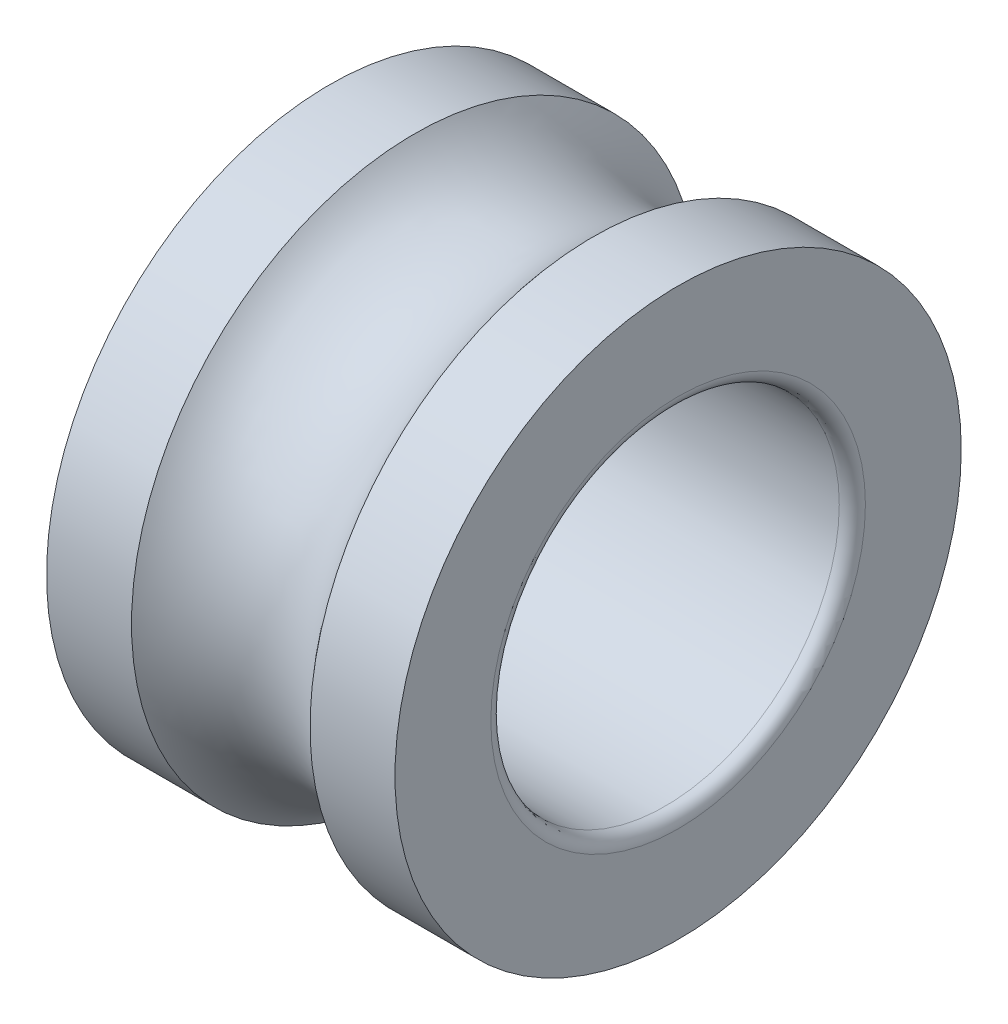
ISO-10303-21;
HEADER;
FILE_DESCRIPTION(('STEP AP214'),'2;1');
FILE_NAME('part.step','',(''),(''),'','','');
FILE_SCHEMA(('AUTOMOTIVE_DESIGN { 1 0 10303 214 1 1 1 1 }'));
ENDSEC;
DATA;
#1=APPLICATION_CONTEXT('core data for automotive mechanical design processes');
#2=APPLICATION_PROTOCOL_DEFINITION('international standard','automotive_design',2000,#1);
#3=PRODUCT_CONTEXT('',#1,'mechanical');
#4=PRODUCT('Part','Part','',(#3));
#5=PRODUCT_RELATED_PRODUCT_CATEGORY('part','',(#4));
#6=PRODUCT_DEFINITION_FORMATION('','',#4);
#7=PRODUCT_DEFINITION_CONTEXT('part definition',#1,'design');
#8=PRODUCT_DEFINITION('design','',#6,#7);
#9=PRODUCT_DEFINITION_SHAPE('','',#8);
#10=(LENGTH_UNIT() NAMED_UNIT(*) SI_UNIT(.MILLI.,.METRE.));
#11=(NAMED_UNIT(*) PLANE_ANGLE_UNIT() SI_UNIT($,.RADIAN.));
#12=(NAMED_UNIT(*) SI_UNIT($,.STERADIAN.) SOLID_ANGLE_UNIT());
#13=UNCERTAINTY_MEASURE_WITH_UNIT(LENGTH_MEASURE(1.E-05),#10,'distance_accuracy_value','');
#14=(GEOMETRIC_REPRESENTATION_CONTEXT(3) GLOBAL_UNCERTAINTY_ASSIGNED_CONTEXT((#13)) GLOBAL_UNIT_ASSIGNED_CONTEXT((#10,
#11,#12)) REPRESENTATION_CONTEXT('',''));
#15=CARTESIAN_POINT('',(0.,0.,0.));
#16=DIRECTION('',(0.,0.,1.));
#17=DIRECTION('',(1.,0.,0.));
#18=AXIS2_PLACEMENT_3D('',#15,#16,#17);
#19=CARTESIAN_POINT('',(-4.,6.5,0.));
#20=DIRECTION('',(-1.,0.,0.));
#21=DIRECTION('',(0.,0.,1.));
#22=AXIS2_PLACEMENT_3D('',#19,#20,#21);
#23=PLANE('',#22);
#24=CARTESIAN_POINT('',(-4.,0.,0.));
#25=DIRECTION('',(1.,0.,0.));
#26=DIRECTION('',(0.,0.,-1.));
#27=AXIS2_PLACEMENT_3D('',#24,#25,#26);
#28=CIRCLE('',#27,4.30000003462705);
#29=CARTESIAN_POINT('',(-4.,0.,-4.30000003462705));
#30=VERTEX_POINT('',#29);
#31=EDGE_CURVE('E44',#30,#30,#28,.T.);
#32=ORIENTED_EDGE('',*,*,#31,.T.);
#33=EDGE_LOOP('',(#32));
#34=FACE_BOUND('',#33,.T.);
#35=CARTESIAN_POINT('',(-4.,0.,0.));
#36=DIRECTION('',(1.,0.,0.));
#37=DIRECTION('',(0.,0.,-1.));
#38=AXIS2_PLACEMENT_3D('',#35,#36,#37);
#39=CIRCLE('',#38,6.5);
#40=CARTESIAN_POINT('',(-4.,0.,-6.5));
#41=VERTEX_POINT('',#40);
#42=EDGE_CURVE('E41',#41,#41,#39,.T.);
#43=ORIENTED_EDGE('',*,*,#42,.F.);
#44=EDGE_LOOP('',(#43));
#45=FACE_BOUND('',#44,.T.);
#46=ADVANCED_FACE('F15',(#34,#45),#23,.T.);
#47=CARTESIAN_POINT('',(-3.70000000000012,0.,0.));
#48=DIRECTION('',(1.,0.,0.));
#49=DIRECTION('',(0.,0.,-1.));
#50=AXIS2_PLACEMENT_3D('',#47,#48,#49);
#51=TOROIDAL_SURFACE('',#50,4.29999999999988,0.299999999999877);
#52=CARTESIAN_POINT('',(-3.7,0.,0.));
#53=DIRECTION('',(1.,0.,0.));
#54=DIRECTION('',(0.,0.,-1.));
#55=AXIS2_PLACEMENT_3D('',#52,#53,#54);
#56=CIRCLE('',#55,4.);
#57=CARTESIAN_POINT('',(-3.7,0.,-4.));
#58=VERTEX_POINT('',#57);
#59=EDGE_CURVE('E38',#58,#58,#56,.T.);
#60=ORIENTED_EDGE('',*,*,#59,.T.);
#61=EDGE_LOOP('',(#60));
#62=FACE_BOUND('',#61,.T.);
#63=ORIENTED_EDGE('',*,*,#31,.F.);
#64=EDGE_LOOP('',(#63));
#65=FACE_BOUND('',#64,.T.);
#66=ADVANCED_FACE('F50',(#62,#65),#51,.T.);
#67=CARTESIAN_POINT('',(4.,0.,0.));
#68=DIRECTION('',(1.,0.,0.));
#69=DIRECTION('',(0.,0.,-1.));
#70=AXIS2_PLACEMENT_3D('',#67,#68,#69);
#71=CYLINDRICAL_SURFACE('',#70,6.5);
#72=ORIENTED_EDGE('',*,*,#42,.T.);
#73=EDGE_LOOP('',(#72));
#74=FACE_BOUND('',#73,.T.);
#75=CARTESIAN_POINT('',(-2.0493901531919,0.,0.));
#76=DIRECTION('',(1.,0.,0.));
#77=DIRECTION('',(0.,0.,-1.));
#78=AXIS2_PLACEMENT_3D('',#75,#76,#77);
#79=CIRCLE('',#78,6.5);
#80=CARTESIAN_POINT('',(-2.0493901531919,0.,-6.5));
#81=VERTEX_POINT('',#80);
#82=EDGE_CURVE('E35',#81,#81,#79,.T.);
#83=ORIENTED_EDGE('',*,*,#82,.F.);
#84=EDGE_LOOP('',(#83));
#85=FACE_BOUND('',#84,.T.);
#86=ADVANCED_FACE('F52',(#74,#85),#71,.T.);
#87=CARTESIAN_POINT('',(4.,0.,0.));
#88=DIRECTION('',(1.,0.,0.));
#89=DIRECTION('',(0.,0.,-1.));
#90=AXIS2_PLACEMENT_3D('',#87,#88,#89);
#91=CYLINDRICAL_SURFACE('',#90,4.);
#92=CARTESIAN_POINT('',(3.7,0.,0.));
#93=DIRECTION('',(1.,0.,0.));
#94=DIRECTION('',(0.,0.,-1.));
#95=AXIS2_PLACEMENT_3D('',#92,#93,#94);
#96=CIRCLE('',#95,4.);
#97=CARTESIAN_POINT('',(3.7,0.,-4.));
#98=VERTEX_POINT('',#97);
#99=EDGE_CURVE('E30',#98,#98,#96,.T.);
#100=ORIENTED_EDGE('',*,*,#99,.T.);
#101=EDGE_LOOP('',(#100));
#102=FACE_BOUND('',#101,.T.);
#103=ORIENTED_EDGE('',*,*,#59,.F.);
#104=EDGE_LOOP('',(#103));
#105=FACE_BOUND('',#104,.T.);
#106=ADVANCED_FACE('F60',(#102,#105),#91,.F.);
#107=CARTESIAN_POINT('',(0.,0.,0.));
#108=DIRECTION('',(1.,0.,0.));
#109=DIRECTION('',(0.,0.,-1.));
#110=AXIS2_PLACEMENT_3D('',#107,#108,#109);
#111=TOROIDAL_SURFACE('',#110,8.1,2.59999999999996);
#112=CARTESIAN_POINT('',(2.0493901531919,0.,0.));
#113=DIRECTION('',(1.,0.,0.));
#114=DIRECTION('',(0.,0.,-1.));
#115=AXIS2_PLACEMENT_3D('',#112,#113,#114);
#116=CIRCLE('',#115,6.5);
#117=CARTESIAN_POINT('',(2.0493901531919,0.,-6.5));
#118=VERTEX_POINT('',#117);
#119=EDGE_CURVE('E26',#118,#118,#116,.T.);
#120=ORIENTED_EDGE('',*,*,#119,.F.);
#121=EDGE_LOOP('',(#120));
#122=FACE_BOUND('',#121,.T.);
#123=ORIENTED_EDGE('',*,*,#82,.T.);
#124=EDGE_LOOP('',(#123));
#125=FACE_BOUND('',#124,.T.);
#126=ADVANCED_FACE('F67',(#122,#125),#111,.F.);
#127=CARTESIAN_POINT('',(3.70000000000012,0.,0.));
#128=DIRECTION('',(1.,0.,0.));
#129=DIRECTION('',(0.,0.,-1.));
#130=AXIS2_PLACEMENT_3D('',#127,#128,#129);
#131=TOROIDAL_SURFACE('',#130,4.29999999999988,0.299999999999877);
#132=CARTESIAN_POINT('',(4.,0.,0.));
#133=DIRECTION('',(1.,0.,0.));
#134=DIRECTION('',(0.,0.,-1.));
#135=AXIS2_PLACEMENT_3D('',#132,#133,#134);
#136=CIRCLE('',#135,4.30000003462705);
#137=CARTESIAN_POINT('',(4.,0.,-4.30000003462705));
#138=VERTEX_POINT('',#137);
#139=EDGE_CURVE('E22',#138,#138,#136,.T.);
#140=ORIENTED_EDGE('',*,*,#139,.T.);
#141=EDGE_LOOP('',(#140));
#142=FACE_BOUND('',#141,.T.);
#143=ORIENTED_EDGE('',*,*,#99,.F.);
#144=EDGE_LOOP('',(#143));
#145=FACE_BOUND('',#144,.T.);
#146=ADVANCED_FACE('F71',(#142,#145),#131,.T.);
#147=CARTESIAN_POINT('',(4.,0.,0.));
#148=DIRECTION('',(1.,0.,0.));
#149=DIRECTION('',(0.,0.,-1.));
#150=AXIS2_PLACEMENT_3D('',#147,#148,#149);
#151=CYLINDRICAL_SURFACE('',#150,6.5);
#152=ORIENTED_EDGE('',*,*,#119,.T.);
#153=EDGE_LOOP('',(#152));
#154=FACE_BOUND('',#153,.T.);
#155=CARTESIAN_POINT('',(4.,0.,0.));
#156=DIRECTION('',(1.,0.,0.));
#157=DIRECTION('',(0.,0.,-1.));
#158=AXIS2_PLACEMENT_3D('',#155,#156,#157);
#159=CIRCLE('',#158,6.5);
#160=CARTESIAN_POINT('',(4.,0.,-6.5));
#161=VERTEX_POINT('',#160);
#162=EDGE_CURVE('E10',#161,#161,#159,.T.);
#163=ORIENTED_EDGE('',*,*,#162,.F.);
#164=EDGE_LOOP('',(#163));
#165=FACE_BOUND('',#164,.T.);
#166=ADVANCED_FACE('F74',(#154,#165),#151,.T.);
#167=CARTESIAN_POINT('',(4.,4.3,0.));
#168=DIRECTION('',(1.,0.,0.));
#169=DIRECTION('',(0.,0.,-1.));
#170=AXIS2_PLACEMENT_3D('',#167,#168,#169);
#171=PLANE('',#170);
#172=ORIENTED_EDGE('',*,*,#162,.T.);
#173=EDGE_LOOP('',(#172));
#174=FACE_BOUND('',#173,.T.);
#175=ORIENTED_EDGE('',*,*,#139,.F.);
#176=EDGE_LOOP('',(#175));
#177=FACE_BOUND('',#176,.T.);
#178=ADVANCED_FACE('F17',(#174,#177),#171,.T.);
#179=CLOSED_SHELL('',(#46,#66,#86,#106,#126,#146,#166,#178));
#180=MANIFOLD_SOLID_BREP('B1',#179);
#181=ADVANCED_BREP_SHAPE_REPRESENTATION('',(#18,#180),#14);
#182=SHAPE_DEFINITION_REPRESENTATION(#9,#181);
ENDSEC;
END-ISO-10303-21;
